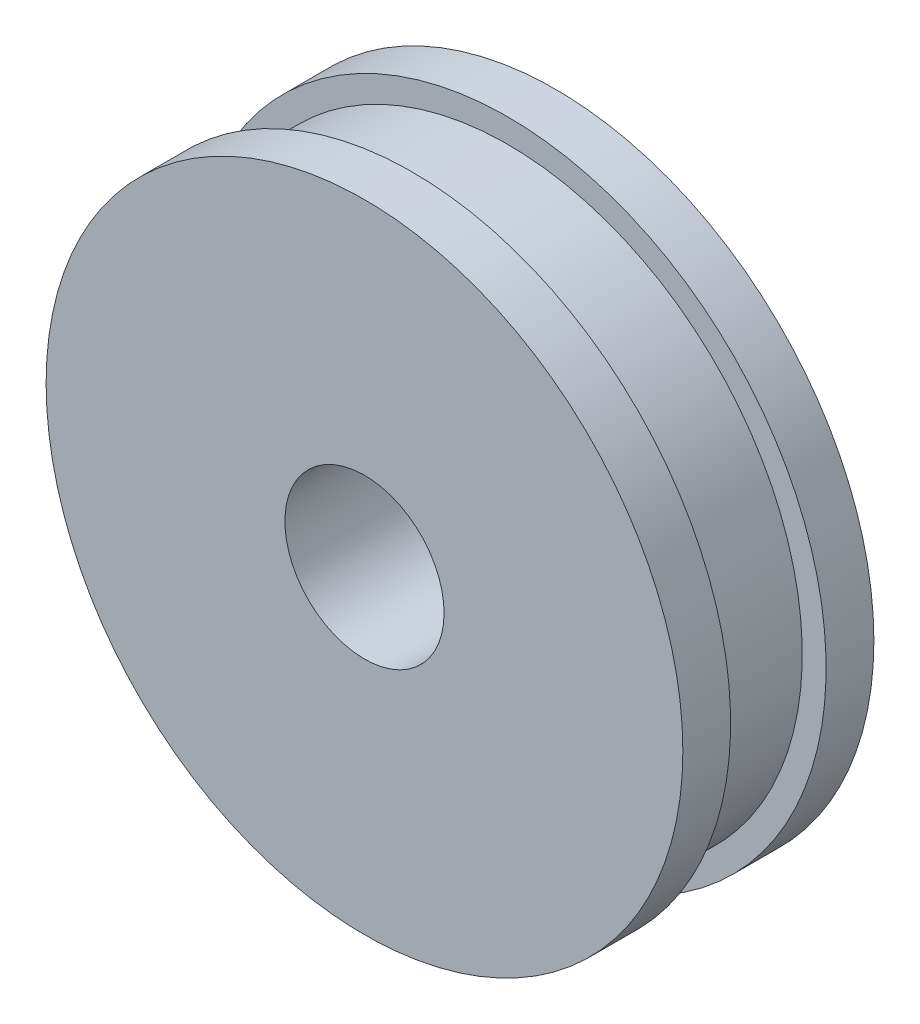
ISO-10303-21;
HEADER;
FILE_DESCRIPTION(('STEP AP214'),'2;1');
FILE_NAME('part.step','',(''),(''),'','','');
FILE_SCHEMA(('AUTOMOTIVE_DESIGN { 1 0 10303 214 1 1 1 1 }'));
ENDSEC;
DATA;
#1=APPLICATION_CONTEXT('core data for automotive mechanical design processes');
#2=APPLICATION_PROTOCOL_DEFINITION('international standard','automotive_design',2000,#1);
#3=PRODUCT_CONTEXT('',#1,'mechanical');
#4=PRODUCT('Part','Part','',(#3));
#5=PRODUCT_RELATED_PRODUCT_CATEGORY('part','',(#4));
#6=PRODUCT_DEFINITION_FORMATION('','',#4);
#7=PRODUCT_DEFINITION_CONTEXT('part definition',#1,'design');
#8=PRODUCT_DEFINITION('design','',#6,#7);
#9=PRODUCT_DEFINITION_SHAPE('','',#8);
#10=(LENGTH_UNIT() NAMED_UNIT(*) SI_UNIT(.MILLI.,.METRE.));
#11=(NAMED_UNIT(*) PLANE_ANGLE_UNIT() SI_UNIT($,.RADIAN.));
#12=(NAMED_UNIT(*) SI_UNIT($,.STERADIAN.) SOLID_ANGLE_UNIT());
#13=UNCERTAINTY_MEASURE_WITH_UNIT(LENGTH_MEASURE(1.E-05),#10,'distance_accuracy_value','');
#14=(GEOMETRIC_REPRESENTATION_CONTEXT(3) GLOBAL_UNCERTAINTY_ASSIGNED_CONTEXT((#13)) GLOBAL_UNIT_ASSIGNED_CONTEXT((#10,
#11,#12)) REPRESENTATION_CONTEXT('',''));
#15=CARTESIAN_POINT('',(0.,0.,0.));
#16=DIRECTION('',(0.,0.,1.));
#17=DIRECTION('',(1.,0.,0.));
#18=AXIS2_PLACEMENT_3D('',#15,#16,#17);
#19=CARTESIAN_POINT('',(0.,0.,12.));
#20=DIRECTION('',(0.,0.,-1.));
#21=DIRECTION('',(-1.,0.,0.));
#22=AXIS2_PLACEMENT_3D('',#19,#20,#21);
#23=CYLINDRICAL_SURFACE('',#22,20.);
#24=CARTESIAN_POINT('',(0.,0.,9.));
#25=DIRECTION('',(0.,0.,-1.));
#26=DIRECTION('',(-1.,0.,0.));
#27=AXIS2_PLACEMENT_3D('',#24,#25,#26);
#28=CIRCLE('',#27,20.);
#29=CARTESIAN_POINT('',(-20.,0.,9.));
#30=VERTEX_POINT('',#29);
#31=EDGE_CURVE('E62',#30,#30,#28,.T.);
#32=ORIENTED_EDGE('',*,*,#31,.F.);
#33=EDGE_LOOP('',(#32));
#34=FACE_BOUND('',#33,.T.);
#35=CARTESIAN_POINT('',(0.,0.,12.));
#36=DIRECTION('',(0.,0.,1.));
#37=DIRECTION('',(1.,0.,0.));
#38=AXIS2_PLACEMENT_3D('',#35,#36,#37);
#39=CIRCLE('',#38,20.);
#40=CARTESIAN_POINT('',(20.,0.,12.));
#41=VERTEX_POINT('',#40);
#42=EDGE_CURVE('E10',#41,#41,#39,.T.);
#43=ORIENTED_EDGE('',*,*,#42,.F.);
#44=EDGE_LOOP('',(#43));
#45=FACE_BOUND('',#44,.T.);
#46=ADVANCED_FACE('F43',(#34,#45),#23,.T.);
#47=CARTESIAN_POINT('',(0.,0.,12.));
#48=DIRECTION('',(0.,0.,1.));
#49=DIRECTION('',(1.,0.,0.));
#50=AXIS2_PLACEMENT_3D('',#47,#48,#49);
#51=PLANE('',#50);
#52=ORIENTED_EDGE('',*,*,#42,.T.);
#53=EDGE_LOOP('',(#52));
#54=FACE_BOUND('',#53,.T.);
#55=CARTESIAN_POINT('',(0.,0.,12.));
#56=DIRECTION('',(0.,0.,1.));
#57=DIRECTION('',(1.,0.,0.));
#58=AXIS2_PLACEMENT_3D('',#55,#56,#57);
#59=CIRCLE('',#58,5.);
#60=CARTESIAN_POINT('',(5.,0.,12.));
#61=VERTEX_POINT('',#60);
#62=EDGE_CURVE('E57',#61,#61,#59,.T.);
#63=ORIENTED_EDGE('',*,*,#62,.F.);
#64=EDGE_LOOP('',(#63));
#65=FACE_BOUND('',#64,.T.);
#66=ADVANCED_FACE('F105',(#54,#65),#51,.T.);
#67=CARTESIAN_POINT('',(0.,0.,0.));
#68=DIRECTION('',(0.,0.,1.));
#69=DIRECTION('',(1.,0.,0.));
#70=AXIS2_PLACEMENT_3D('',#67,#68,#69);
#71=PLANE('',#70);
#72=CARTESIAN_POINT('',(0.,0.,0.));
#73=DIRECTION('',(0.,0.,1.));
#74=DIRECTION('',(1.,0.,0.));
#75=AXIS2_PLACEMENT_3D('',#72,#73,#74);
#76=CIRCLE('',#75,20.);
#77=CARTESIAN_POINT('',(20.,0.,0.));
#78=VERTEX_POINT('',#77);
#79=EDGE_CURVE('E47',#78,#78,#76,.T.);
#80=ORIENTED_EDGE('',*,*,#79,.F.);
#81=EDGE_LOOP('',(#80));
#82=FACE_BOUND('',#81,.T.);
#83=CARTESIAN_POINT('',(0.,0.,0.));
#84=DIRECTION('',(0.,0.,1.));
#85=DIRECTION('',(1.,0.,0.));
#86=AXIS2_PLACEMENT_3D('',#83,#84,#85);
#87=CIRCLE('',#86,5.);
#88=CARTESIAN_POINT('',(5.,0.,0.));
#89=VERTEX_POINT('',#88);
#90=EDGE_CURVE('E59',#89,#89,#87,.T.);
#91=ORIENTED_EDGE('',*,*,#90,.T.);
#92=EDGE_LOOP('',(#91));
#93=FACE_BOUND('',#92,.T.);
#94=ADVANCED_FACE('F108',(#82,#93),#71,.F.);
#95=CARTESIAN_POINT('',(0.,0.,3.));
#96=DIRECTION('',(0.,0.,-1.));
#97=DIRECTION('',(-1.,0.,0.));
#98=AXIS2_PLACEMENT_3D('',#95,#96,#97);
#99=CIRCLE('',#98,20.);
#100=CARTESIAN_POINT('',(-20.,0.,3.));
#101=VERTEX_POINT('',#100);
#102=EDGE_CURVE('E77',#101,#101,#99,.T.);
#103=ORIENTED_EDGE('',*,*,#102,.T.);
#104=EDGE_LOOP('',(#103));
#105=FACE_BOUND('',#104,.T.);
#106=ORIENTED_EDGE('',*,*,#79,.T.);
#107=EDGE_LOOP('',(#106));
#108=FACE_BOUND('',#107,.T.);
#109=ADVANCED_FACE('F45',(#105,#108),#23,.T.);
#110=CARTESIAN_POINT('',(0.,0.,12.));
#111=DIRECTION('',(0.,0.,-1.));
#112=DIRECTION('',(-1.,0.,0.));
#113=AXIS2_PLACEMENT_3D('',#110,#111,#112);
#114=CYLINDRICAL_SURFACE('',#113,5.);
#115=ORIENTED_EDGE('',*,*,#62,.T.);
#116=EDGE_LOOP('',(#115));
#117=FACE_BOUND('',#116,.T.);
#118=ORIENTED_EDGE('',*,*,#90,.F.);
#119=EDGE_LOOP('',(#118));
#120=FACE_BOUND('',#119,.T.);
#121=ADVANCED_FACE('F99',(#117,#120),#114,.F.);
#122=CARTESIAN_POINT('',(-20.,0.,9.));
#123=DIRECTION('',(0.,0.,1.));
#124=DIRECTION('',(1.,0.,0.));
#125=AXIS2_PLACEMENT_3D('',#122,#123,#124);
#126=PLANE('',#125);
#127=CARTESIAN_POINT('',(0.,0.,9.));
#128=DIRECTION('',(0.,0.,-1.));
#129=DIRECTION('',(-1.,0.,0.));
#130=AXIS2_PLACEMENT_3D('',#127,#128,#129);
#131=CIRCLE('',#130,18.5);
#132=CARTESIAN_POINT('',(-18.5,0.,9.));
#133=VERTEX_POINT('',#132);
#134=EDGE_CURVE('E69',#133,#133,#131,.T.);
#135=ORIENTED_EDGE('',*,*,#134,.F.);
#136=EDGE_LOOP('',(#135));
#137=FACE_BOUND('',#136,.T.);
#138=ORIENTED_EDGE('',*,*,#31,.T.);
#139=EDGE_LOOP('',(#138));
#140=FACE_BOUND('',#139,.T.);
#141=ADVANCED_FACE('F93',(#137,#140),#126,.F.);
#142=CARTESIAN_POINT('',(0.,0.,-8.60208193994272));
#143=DIRECTION('',(0.,0.,-1.));
#144=DIRECTION('',(-1.,0.,0.));
#145=AXIS2_PLACEMENT_3D('',#142,#143,#144);
#146=CYLINDRICAL_SURFACE('',#145,18.5);
#147=CARTESIAN_POINT('',(0.,0.,3.));
#148=DIRECTION('',(0.,0.,-1.));
#149=DIRECTION('',(-1.,0.,0.));
#150=AXIS2_PLACEMENT_3D('',#147,#148,#149);
#151=CIRCLE('',#150,18.5);
#152=CARTESIAN_POINT('',(-18.5,0.,3.));
#153=VERTEX_POINT('',#152);
#154=EDGE_CURVE('E73',#153,#153,#151,.T.);
#155=ORIENTED_EDGE('',*,*,#154,.F.);
#156=EDGE_LOOP('',(#155));
#157=FACE_BOUND('',#156,.T.);
#158=ORIENTED_EDGE('',*,*,#134,.T.);
#159=EDGE_LOOP('',(#158));
#160=FACE_BOUND('',#159,.T.);
#161=ADVANCED_FACE('F87',(#157,#160),#146,.T.);
#162=CARTESIAN_POINT('',(-20.,0.,3.));
#163=DIRECTION('',(0.,0.,-1.));
#164=DIRECTION('',(-1.,0.,0.));
#165=AXIS2_PLACEMENT_3D('',#162,#163,#164);
#166=PLANE('',#165);
#167=ORIENTED_EDGE('',*,*,#102,.F.);
#168=EDGE_LOOP('',(#167));
#169=FACE_BOUND('',#168,.T.);
#170=ORIENTED_EDGE('',*,*,#154,.T.);
#171=EDGE_LOOP('',(#170));
#172=FACE_BOUND('',#171,.T.);
#173=ADVANCED_FACE('F84',(#169,#172),#166,.F.);
#174=CLOSED_SHELL('',(#46,#66,#94,#109,#121,#141,#161,#173));
#175=MANIFOLD_SOLID_BREP('B2',#174);
#176=ADVANCED_BREP_SHAPE_REPRESENTATION('',(#18,#175),#14);
#177=SHAPE_DEFINITION_REPRESENTATION(#9,#176);
ENDSEC;
END-ISO-10303-21;
